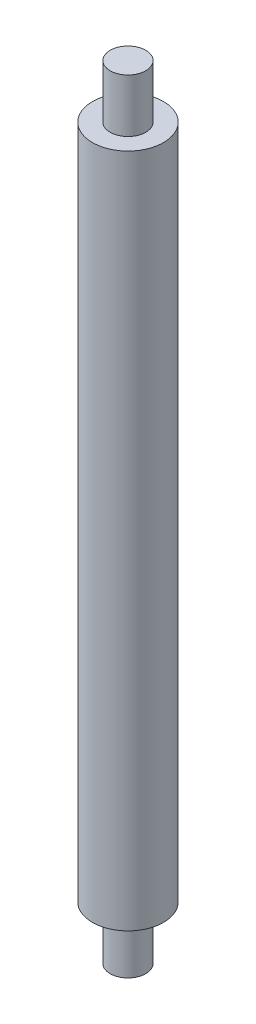
ISO-10303-21;
HEADER;
FILE_DESCRIPTION(('STEP AP214'),'2;1');
FILE_NAME('part.step','',(''),(''),'','','');
FILE_SCHEMA(('AUTOMOTIVE_DESIGN { 1 0 10303 214 1 1 1 1 }'));
ENDSEC;
DATA;
#1=APPLICATION_CONTEXT('core data for automotive mechanical design processes');
#2=APPLICATION_PROTOCOL_DEFINITION('international standard','automotive_design',2000,#1);
#3=PRODUCT_CONTEXT('',#1,'mechanical');
#4=PRODUCT('Part','Part','',(#3));
#5=PRODUCT_RELATED_PRODUCT_CATEGORY('part','',(#4));
#6=PRODUCT_DEFINITION_FORMATION('','',#4);
#7=PRODUCT_DEFINITION_CONTEXT('part definition',#1,'design');
#8=PRODUCT_DEFINITION('design','',#6,#7);
#9=PRODUCT_DEFINITION_SHAPE('','',#8);
#10=(LENGTH_UNIT() NAMED_UNIT(*) SI_UNIT(.MILLI.,.METRE.));
#11=(NAMED_UNIT(*) PLANE_ANGLE_UNIT() SI_UNIT($,.RADIAN.));
#12=(NAMED_UNIT(*) SI_UNIT($,.STERADIAN.) SOLID_ANGLE_UNIT());
#13=UNCERTAINTY_MEASURE_WITH_UNIT(LENGTH_MEASURE(1.E-05),#10,'distance_accuracy_value','');
#14=(GEOMETRIC_REPRESENTATION_CONTEXT(3) GLOBAL_UNCERTAINTY_ASSIGNED_CONTEXT((#13)) GLOBAL_UNIT_ASSIGNED_CONTEXT((#10,
#11,#12)) REPRESENTATION_CONTEXT('',''));
#15=CARTESIAN_POINT('',(0.,0.,0.));
#16=DIRECTION('',(0.,0.,1.));
#17=DIRECTION('',(1.,0.,0.));
#18=AXIS2_PLACEMENT_3D('',#15,#16,#17);
#19=CARTESIAN_POINT('',(0.,11.,0.));
#20=DIRECTION('',(0.,-1.,0.));
#21=DIRECTION('',(1.,0.,0.));
#22=AXIS2_PLACEMENT_3D('',#19,#20,#21);
#23=PLANE('',#22);
#24=CARTESIAN_POINT('',(0.,11.,0.));
#25=DIRECTION('',(0.,1.,0.));
#26=DIRECTION('',(-1.,0.,0.));
#27=AXIS2_PLACEMENT_3D('',#24,#25,#26);
#28=CIRCLE('',#27,0.499999999999999);
#29=CARTESIAN_POINT('',(-0.499999999999999,11.,0.));
#30=VERTEX_POINT('',#29);
#31=EDGE_CURVE('E10',#30,#30,#28,.T.);
#32=ORIENTED_EDGE('',*,*,#31,.T.);
#33=EDGE_LOOP('',(#32));
#34=FACE_BOUND('',#33,.T.);
#35=ADVANCED_FACE('F41',(#34),#23,.F.);
#36=CARTESIAN_POINT('',(0.,11.,0.));
#37=DIRECTION('',(0.,1.,0.));
#38=DIRECTION('',(-1.,0.,0.));
#39=AXIS2_PLACEMENT_3D('',#36,#37,#38);
#40=CYLINDRICAL_SURFACE('',#39,0.5);
#41=ORIENTED_EDGE('',*,*,#31,.F.);
#42=EDGE_LOOP('',(#41));
#43=FACE_BOUND('',#42,.T.);
#44=CARTESIAN_POINT('',(0.,9.5,0.));
#45=DIRECTION('',(0.,1.,0.));
#46=DIRECTION('',(-1.,0.,0.));
#47=AXIS2_PLACEMENT_3D('',#44,#45,#46);
#48=CIRCLE('',#47,0.500000000000002);
#49=CARTESIAN_POINT('',(-0.500000000000002,9.5,0.));
#50=VERTEX_POINT('',#49);
#51=EDGE_CURVE('E47',#50,#50,#48,.T.);
#52=ORIENTED_EDGE('',*,*,#51,.T.);
#53=EDGE_LOOP('',(#52));
#54=FACE_BOUND('',#53,.T.);
#55=ADVANCED_FACE('F79',(#43,#54),#40,.T.);
#56=CARTESIAN_POINT('',(0.500000000000002,9.5,0.));
#57=DIRECTION('',(0.,-1.,0.));
#58=DIRECTION('',(1.,0.,0.));
#59=AXIS2_PLACEMENT_3D('',#56,#57,#58);
#60=PLANE('',#59);
#61=ORIENTED_EDGE('',*,*,#51,.F.);
#62=EDGE_LOOP('',(#61));
#63=FACE_BOUND('',#62,.T.);
#64=CARTESIAN_POINT('',(0.,9.5,0.));
#65=DIRECTION('',(0.,1.,0.));
#66=DIRECTION('',(-1.,0.,0.));
#67=AXIS2_PLACEMENT_3D('',#64,#65,#66);
#68=CIRCLE('',#67,1.);
#69=CARTESIAN_POINT('',(-1.,9.5,0.));
#70=VERTEX_POINT('',#69);
#71=EDGE_CURVE('E51',#70,#70,#68,.T.);
#72=ORIENTED_EDGE('',*,*,#71,.T.);
#73=EDGE_LOOP('',(#72));
#74=FACE_BOUND('',#73,.T.);
#75=ADVANCED_FACE('F83',(#63,#74),#60,.F.);
#76=CARTESIAN_POINT('',(0.,11.,0.));
#77=DIRECTION('',(0.,1.,0.));
#78=DIRECTION('',(-1.,0.,0.));
#79=AXIS2_PLACEMENT_3D('',#76,#77,#78);
#80=CYLINDRICAL_SURFACE('',#79,1.);
#81=ORIENTED_EDGE('',*,*,#71,.F.);
#82=EDGE_LOOP('',(#81));
#83=FACE_BOUND('',#82,.T.);
#84=CARTESIAN_POINT('',(0.,-9.5,0.));
#85=DIRECTION('',(0.,1.,0.));
#86=DIRECTION('',(-1.,0.,0.));
#87=AXIS2_PLACEMENT_3D('',#84,#85,#86);
#88=CIRCLE('',#87,1.);
#89=CARTESIAN_POINT('',(-0.999999999999997,-9.5,0.));
#90=VERTEX_POINT('',#89);
#91=EDGE_CURVE('E55',#90,#90,#88,.T.);
#92=ORIENTED_EDGE('',*,*,#91,.T.);
#93=EDGE_LOOP('',(#92));
#94=FACE_BOUND('',#93,.T.);
#95=ADVANCED_FACE('F88',(#83,#94),#80,.T.);
#96=CARTESIAN_POINT('',(1.,-9.5,0.));
#97=DIRECTION('',(0.,1.,0.));
#98=DIRECTION('',(-1.,0.,0.));
#99=AXIS2_PLACEMENT_3D('',#96,#97,#98);
#100=PLANE('',#99);
#101=ORIENTED_EDGE('',*,*,#91,.F.);
#102=EDGE_LOOP('',(#101));
#103=FACE_BOUND('',#102,.T.);
#104=CARTESIAN_POINT('',(0.,-9.5,0.));
#105=DIRECTION('',(0.,1.,0.));
#106=DIRECTION('',(-1.,0.,0.));
#107=AXIS2_PLACEMENT_3D('',#104,#105,#106);
#108=CIRCLE('',#107,0.5);
#109=CARTESIAN_POINT('',(-0.499999999999997,-9.5,0.));
#110=VERTEX_POINT('',#109);
#111=EDGE_CURVE('E60',#110,#110,#108,.T.);
#112=ORIENTED_EDGE('',*,*,#111,.T.);
#113=EDGE_LOOP('',(#112));
#114=FACE_BOUND('',#113,.T.);
#115=ADVANCED_FACE('F75',(#103,#114),#100,.F.);
#116=CARTESIAN_POINT('',(0.,11.,0.));
#117=DIRECTION('',(0.,1.,0.));
#118=DIRECTION('',(-1.,0.,0.));
#119=AXIS2_PLACEMENT_3D('',#116,#117,#118);
#120=CYLINDRICAL_SURFACE('',#119,0.5);
#121=ORIENTED_EDGE('',*,*,#111,.F.);
#122=EDGE_LOOP('',(#121));
#123=FACE_BOUND('',#122,.T.);
#124=CARTESIAN_POINT('',(0.,-11.,0.));
#125=DIRECTION('',(0.,1.,0.));
#126=DIRECTION('',(-1.,0.,0.));
#127=AXIS2_PLACEMENT_3D('',#124,#125,#126);
#128=CIRCLE('',#127,0.5);
#129=CARTESIAN_POINT('',(-0.499999999999997,-11.,0.));
#130=VERTEX_POINT('',#129);
#131=EDGE_CURVE('E63',#130,#130,#128,.T.);
#132=ORIENTED_EDGE('',*,*,#131,.T.);
#133=EDGE_LOOP('',(#132));
#134=FACE_BOUND('',#133,.T.);
#135=ADVANCED_FACE('F67',(#123,#134),#120,.T.);
#136=CARTESIAN_POINT('',(0.500000000000003,-11.,0.));
#137=DIRECTION('',(0.,1.,0.));
#138=DIRECTION('',(-1.,0.,0.));
#139=AXIS2_PLACEMENT_3D('',#136,#137,#138);
#140=PLANE('',#139);
#141=ORIENTED_EDGE('',*,*,#131,.F.);
#142=EDGE_LOOP('',(#141));
#143=FACE_BOUND('',#142,.T.);
#144=ADVANCED_FACE('F69',(#143),#140,.F.);
#145=CLOSED_SHELL('',(#35,#55,#75,#95,#115,#135,#144));
#146=MANIFOLD_SOLID_BREP('B2',#145);
#147=ADVANCED_BREP_SHAPE_REPRESENTATION('',(#18,#146),#14);
#148=SHAPE_DEFINITION_REPRESENTATION(#9,#147);
ENDSEC;
END-ISO-10303-21;
